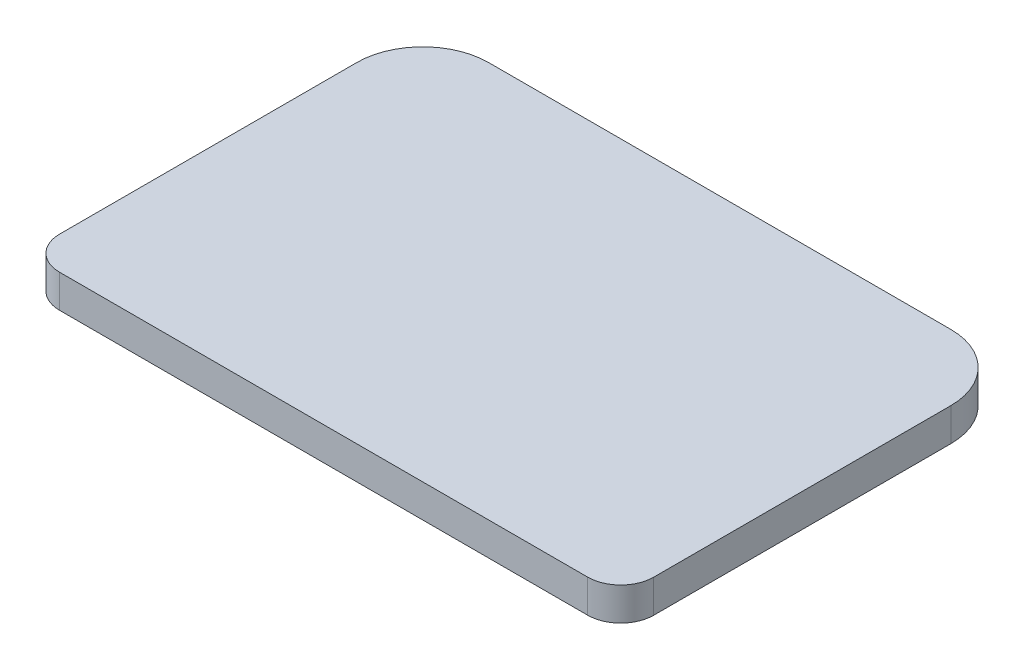
ISO-10303-21;
HEADER;
FILE_DESCRIPTION(('STEP AP214'),'2;1');
FILE_NAME('part.step','',(''),(''),'','','');
FILE_SCHEMA(('AUTOMOTIVE_DESIGN { 1 0 10303 214 1 1 1 1 }'));
ENDSEC;
DATA;
#1=APPLICATION_CONTEXT('core data for automotive mechanical design processes');
#2=APPLICATION_PROTOCOL_DEFINITION('international standard','automotive_design',2000,#1);
#3=PRODUCT_CONTEXT('',#1,'mechanical');
#4=PRODUCT('Part','Part','',(#3));
#5=PRODUCT_RELATED_PRODUCT_CATEGORY('part','',(#4));
#6=PRODUCT_DEFINITION_FORMATION('','',#4);
#7=PRODUCT_DEFINITION_CONTEXT('part definition',#1,'design');
#8=PRODUCT_DEFINITION('design','',#6,#7);
#9=PRODUCT_DEFINITION_SHAPE('','',#8);
#10=(LENGTH_UNIT() NAMED_UNIT(*) SI_UNIT(.MILLI.,.METRE.));
#11=(NAMED_UNIT(*) PLANE_ANGLE_UNIT() SI_UNIT($,.RADIAN.));
#12=(NAMED_UNIT(*) SI_UNIT($,.STERADIAN.) SOLID_ANGLE_UNIT());
#13=UNCERTAINTY_MEASURE_WITH_UNIT(LENGTH_MEASURE(1.E-05),#10,'distance_accuracy_value','');
#14=(GEOMETRIC_REPRESENTATION_CONTEXT(3) GLOBAL_UNCERTAINTY_ASSIGNED_CONTEXT((#13)) GLOBAL_UNIT_ASSIGNED_CONTEXT((#10,
#11,#12)) REPRESENTATION_CONTEXT('',''));
#15=CARTESIAN_POINT('',(0.,0.,0.));
#16=DIRECTION('',(0.,0.,1.));
#17=DIRECTION('',(1.,0.,0.));
#18=AXIS2_PLACEMENT_3D('',#15,#16,#17);
#19=CARTESIAN_POINT('',(28.575,3.175,19.05));
#20=DIRECTION('',(-1.,0.,0.));
#21=DIRECTION('',(0.,0.,-1.));
#22=AXIS2_PLACEMENT_3D('',#19,#20,#21);
#23=PLANE('',#22);
#24=DIRECTION('',(0.,0.,1.));
#25=VECTOR('',#24,1.);
#26=CARTESIAN_POINT('',(28.575,0.,19.05));
#27=LINE('',#26,#25);
#28=CARTESIAN_POINT('',(28.575,0.,-12.7));
#29=VERTEX_POINT('',#28);
#30=CARTESIAN_POINT('',(28.575,0.,15.875));
#31=VERTEX_POINT('',#30);
#32=EDGE_CURVE('E111',#29,#31,#27,.T.);
#33=ORIENTED_EDGE('',*,*,#32,.F.);
#34=DIRECTION('',(0.,-1.,0.));
#35=VECTOR('',#34,1.);
#36=CARTESIAN_POINT('',(28.575,3.175,-12.7));
#37=LINE('',#36,#35);
#38=CARTESIAN_POINT('',(28.575,3.175,-12.7));
#39=VERTEX_POINT('',#38);
#40=EDGE_CURVE('E121',#39,#29,#37,.T.);
#41=ORIENTED_EDGE('',*,*,#40,.F.);
#42=DIRECTION('',(0.,0.,1.));
#43=VECTOR('',#42,1.);
#44=CARTESIAN_POINT('',(28.575,3.175,19.05));
#45=LINE('',#44,#43);
#46=CARTESIAN_POINT('',(28.575,3.175,15.875));
#47=VERTEX_POINT('',#46);
#48=EDGE_CURVE('E139',#39,#47,#45,.T.);
#49=ORIENTED_EDGE('',*,*,#48,.T.);
#50=DIRECTION('',(0.,-1.,0.));
#51=VECTOR('',#50,1.);
#52=CARTESIAN_POINT('',(28.575,3.175,15.875));
#53=LINE('',#52,#51);
#54=EDGE_CURVE('E129',#31,#47,#53,.F.);
#55=ORIENTED_EDGE('',*,*,#54,.F.);
#56=EDGE_LOOP('',(#33,#41,#49,#55));
#57=FACE_BOUND('',#56,.T.);
#58=ADVANCED_FACE('F41',(#57),#23,.F.);
#59=CARTESIAN_POINT('',(-28.575,3.175,19.05));
#60=DIRECTION('',(0.,0.,-1.));
#61=DIRECTION('',(1.,0.,0.));
#62=AXIS2_PLACEMENT_3D('',#59,#60,#61);
#63=PLANE('',#62);
#64=DIRECTION('',(-1.,0.,0.));
#65=VECTOR('',#64,1.);
#66=CARTESIAN_POINT('',(-28.575,3.175,19.05));
#67=LINE('',#66,#65);
#68=CARTESIAN_POINT('',(25.4,3.175,19.05));
#69=VERTEX_POINT('',#68);
#70=CARTESIAN_POINT('',(-25.4,3.175,19.05));
#71=VERTEX_POINT('',#70);
#72=EDGE_CURVE('E170',#69,#71,#67,.T.);
#73=ORIENTED_EDGE('',*,*,#72,.T.);
#74=DIRECTION('',(0.,-1.,0.));
#75=VECTOR('',#74,1.);
#76=CARTESIAN_POINT('',(-25.4,3.175,19.05));
#77=LINE('',#76,#75);
#78=CARTESIAN_POINT('',(-25.4,0.,19.05));
#79=VERTEX_POINT('',#78);
#80=EDGE_CURVE('E152',#79,#71,#77,.F.);
#81=ORIENTED_EDGE('',*,*,#80,.F.);
#82=DIRECTION('',(-1.,0.,0.));
#83=VECTOR('',#82,1.);
#84=CARTESIAN_POINT('',(-28.575,0.,19.05));
#85=LINE('',#84,#83);
#86=CARTESIAN_POINT('',(25.4,0.,19.05));
#87=VERTEX_POINT('',#86);
#88=EDGE_CURVE('E130',#87,#79,#85,.T.);
#89=ORIENTED_EDGE('',*,*,#88,.F.);
#90=DIRECTION('',(0.,-1.,0.));
#91=VECTOR('',#90,1.);
#92=CARTESIAN_POINT('',(25.4,3.175,19.05));
#93=LINE('',#92,#91);
#94=EDGE_CURVE('E154',#69,#87,#93,.T.);
#95=ORIENTED_EDGE('',*,*,#94,.F.);
#96=EDGE_LOOP('',(#73,#81,#89,#95));
#97=FACE_BOUND('',#96,.T.);
#98=ADVANCED_FACE('F168',(#97),#63,.F.);
#99=CARTESIAN_POINT('',(-28.575,3.175,19.05));
#100=DIRECTION('',(1.,0.,0.));
#101=DIRECTION('',(0.,0.,1.));
#102=AXIS2_PLACEMENT_3D('',#99,#100,#101);
#103=PLANE('',#102);
#104=DIRECTION('',(0.,0.,-1.));
#105=VECTOR('',#104,1.);
#106=CARTESIAN_POINT('',(-28.575,3.175,19.05));
#107=LINE('',#106,#105);
#108=CARTESIAN_POINT('',(-28.575,3.175,15.875));
#109=VERTEX_POINT('',#108);
#110=CARTESIAN_POINT('',(-28.575,3.175,-12.7));
#111=VERTEX_POINT('',#110);
#112=EDGE_CURVE('E173',#109,#111,#107,.T.);
#113=ORIENTED_EDGE('',*,*,#112,.T.);
#114=DIRECTION('',(0.,-1.,0.));
#115=VECTOR('',#114,1.);
#116=CARTESIAN_POINT('',(-28.575,3.175,-12.7));
#117=LINE('',#116,#115);
#118=CARTESIAN_POINT('',(-28.575,0.,-12.7));
#119=VERTEX_POINT('',#118);
#120=EDGE_CURVE('E149',#119,#111,#117,.F.);
#121=ORIENTED_EDGE('',*,*,#120,.F.);
#122=DIRECTION('',(0.,0.,-1.));
#123=VECTOR('',#122,1.);
#124=CARTESIAN_POINT('',(-28.575,0.,19.05));
#125=LINE('',#124,#123);
#126=CARTESIAN_POINT('',(-28.575,0.,15.875));
#127=VERTEX_POINT('',#126);
#128=EDGE_CURVE('E132',#127,#119,#125,.T.);
#129=ORIENTED_EDGE('',*,*,#128,.F.);
#130=DIRECTION('',(0.,-1.,0.));
#131=VECTOR('',#130,1.);
#132=CARTESIAN_POINT('',(-28.575,3.175,15.875));
#133=LINE('',#132,#131);
#134=EDGE_CURVE('E11',#109,#127,#133,.T.);
#135=ORIENTED_EDGE('',*,*,#134,.F.);
#136=EDGE_LOOP('',(#113,#121,#129,#135));
#137=FACE_BOUND('',#136,.T.);
#138=ADVANCED_FACE('F186',(#137),#103,.F.);
#139=CARTESIAN_POINT('',(-28.575,3.175,-19.05));
#140=DIRECTION('',(0.,0.,1.));
#141=DIRECTION('',(-1.,0.,0.));
#142=AXIS2_PLACEMENT_3D('',#139,#140,#141);
#143=PLANE('',#142);
#144=DIRECTION('',(1.,0.,0.));
#145=VECTOR('',#144,1.);
#146=CARTESIAN_POINT('',(-28.575,0.,-19.05));
#147=LINE('',#146,#145);
#148=CARTESIAN_POINT('',(-22.225,0.,-19.05));
#149=VERTEX_POINT('',#148);
#150=CARTESIAN_POINT('',(22.225,0.,-19.05));
#151=VERTEX_POINT('',#150);
#152=EDGE_CURVE('E113',#149,#151,#147,.T.);
#153=ORIENTED_EDGE('',*,*,#152,.F.);
#154=DIRECTION('',(0.,-1.,0.));
#155=VECTOR('',#154,1.);
#156=CARTESIAN_POINT('',(-22.225,3.175,-19.05));
#157=LINE('',#156,#155);
#158=CARTESIAN_POINT('',(-22.225,3.175,-19.05));
#159=VERTEX_POINT('',#158);
#160=EDGE_CURVE('E117',#159,#149,#157,.T.);
#161=ORIENTED_EDGE('',*,*,#160,.F.);
#162=DIRECTION('',(1.,0.,0.));
#163=VECTOR('',#162,1.);
#164=CARTESIAN_POINT('',(-28.575,3.175,-19.05));
#165=LINE('',#164,#163);
#166=CARTESIAN_POINT('',(22.225,3.175,-19.05));
#167=VERTEX_POINT('',#166);
#168=EDGE_CURVE('E126',#159,#167,#165,.T.);
#169=ORIENTED_EDGE('',*,*,#168,.T.);
#170=DIRECTION('',(0.,-1.,0.));
#171=VECTOR('',#170,1.);
#172=CARTESIAN_POINT('',(22.225,3.175,-19.05));
#173=LINE('',#172,#171);
#174=EDGE_CURVE('E144',#151,#167,#173,.F.);
#175=ORIENTED_EDGE('',*,*,#174,.F.);
#176=EDGE_LOOP('',(#153,#161,#169,#175));
#177=FACE_BOUND('',#176,.T.);
#178=ADVANCED_FACE('F181',(#177),#143,.F.);
#179=CARTESIAN_POINT('',(0.,3.175,0.));
#180=DIRECTION('',(0.,1.,0.));
#181=DIRECTION('',(0.,0.,-1.));
#182=AXIS2_PLACEMENT_3D('',#179,#180,#181);
#183=PLANE('',#182);
#184=ORIENTED_EDGE('',*,*,#48,.F.);
#185=CARTESIAN_POINT('',(22.225,3.175,-12.7));
#186=DIRECTION('',(0.,-1.,0.));
#187=DIRECTION('',(0.,0.,-1.));
#188=AXIS2_PLACEMENT_3D('',#185,#186,#187);
#189=CIRCLE('',#188,6.35);
#190=EDGE_CURVE('E123',#167,#39,#189,.T.);
#191=ORIENTED_EDGE('',*,*,#190,.F.);
#192=ORIENTED_EDGE('',*,*,#168,.F.);
#193=CARTESIAN_POINT('',(-22.225,3.175,-12.7));
#194=DIRECTION('',(0.,-1.,0.));
#195=DIRECTION('',(0.,0.,-1.));
#196=AXIS2_PLACEMENT_3D('',#193,#194,#195);
#197=CIRCLE('',#196,6.35);
#198=EDGE_CURVE('E146',#111,#159,#197,.T.);
#199=ORIENTED_EDGE('',*,*,#198,.F.);
#200=ORIENTED_EDGE('',*,*,#112,.F.);
#201=CARTESIAN_POINT('',(-25.4,3.175,15.875));
#202=DIRECTION('',(0.,-1.,0.));
#203=DIRECTION('',(0.,0.,-1.));
#204=AXIS2_PLACEMENT_3D('',#201,#202,#203);
#205=CIRCLE('',#204,3.175);
#206=EDGE_CURVE('E55',#71,#109,#205,.T.);
#207=ORIENTED_EDGE('',*,*,#206,.F.);
#208=ORIENTED_EDGE('',*,*,#72,.F.);
#209=CARTESIAN_POINT('',(25.4,3.175,15.875));
#210=DIRECTION('',(0.,-1.,0.));
#211=DIRECTION('',(0.,0.,-1.));
#212=AXIS2_PLACEMENT_3D('',#209,#210,#211);
#213=CIRCLE('',#212,3.175);
#214=EDGE_CURVE('E49',#47,#69,#213,.T.);
#215=ORIENTED_EDGE('',*,*,#214,.F.);
#216=EDGE_LOOP('',(#184,#191,#192,#199,#200,#207,#208,#215));
#217=FACE_BOUND('',#216,.T.);
#218=ADVANCED_FACE('F171',(#217),#183,.T.);
#219=CARTESIAN_POINT('',(0.,0.,0.));
#220=DIRECTION('',(0.,1.,0.));
#221=DIRECTION('',(0.,0.,-1.));
#222=AXIS2_PLACEMENT_3D('',#219,#220,#221);
#223=PLANE('',#222);
#224=ORIENTED_EDGE('',*,*,#88,.T.);
#225=CARTESIAN_POINT('',(-25.4,0.,15.875));
#226=DIRECTION('',(0.,-1.,0.));
#227=DIRECTION('',(0.,0.,-1.));
#228=AXIS2_PLACEMENT_3D('',#225,#226,#227);
#229=CIRCLE('',#228,3.175);
#230=EDGE_CURVE('E157',#127,#79,#229,.F.);
#231=ORIENTED_EDGE('',*,*,#230,.F.);
#232=ORIENTED_EDGE('',*,*,#128,.T.);
#233=CARTESIAN_POINT('',(-22.225,0.,-12.7));
#234=DIRECTION('',(0.,-1.,0.));
#235=DIRECTION('',(0.,0.,-1.));
#236=AXIS2_PLACEMENT_3D('',#233,#234,#235);
#237=CIRCLE('',#236,6.35);
#238=EDGE_CURVE('E118',#149,#119,#237,.F.);
#239=ORIENTED_EDGE('',*,*,#238,.F.);
#240=ORIENTED_EDGE('',*,*,#152,.T.);
#241=CARTESIAN_POINT('',(22.225,0.,-12.7));
#242=DIRECTION('',(0.,-1.,0.));
#243=DIRECTION('',(0.,0.,-1.));
#244=AXIS2_PLACEMENT_3D('',#241,#242,#243);
#245=CIRCLE('',#244,6.35);
#246=EDGE_CURVE('E106',#29,#151,#245,.F.);
#247=ORIENTED_EDGE('',*,*,#246,.F.);
#248=ORIENTED_EDGE('',*,*,#32,.T.);
#249=CARTESIAN_POINT('',(25.4,0.,15.875));
#250=DIRECTION('',(0.,-1.,0.));
#251=DIRECTION('',(0.,0.,-1.));
#252=AXIS2_PLACEMENT_3D('',#249,#250,#251);
#253=CIRCLE('',#252,3.175);
#254=EDGE_CURVE('E159',#87,#31,#253,.F.);
#255=ORIENTED_EDGE('',*,*,#254,.F.);
#256=EDGE_LOOP('',(#224,#231,#232,#239,#240,#247,#248,#255));
#257=FACE_BOUND('',#256,.T.);
#258=ADVANCED_FACE('F109',(#257),#223,.F.);
#259=CARTESIAN_POINT('',(22.225,3.175,-12.7));
#260=DIRECTION('',(0.,-1.,0.));
#261=DIRECTION('',(0.,0.,1.));
#262=AXIS2_PLACEMENT_3D('',#259,#260,#261);
#263=CYLINDRICAL_SURFACE('',#262,6.35);
#264=ORIENTED_EDGE('',*,*,#190,.T.);
#265=ORIENTED_EDGE('',*,*,#40,.T.);
#266=ORIENTED_EDGE('',*,*,#246,.T.);
#267=ORIENTED_EDGE('',*,*,#174,.T.);
#268=EDGE_LOOP('',(#264,#265,#266,#267));
#269=FACE_BOUND('',#268,.T.);
#270=ADVANCED_FACE('F122',(#269),#263,.T.);
#271=CARTESIAN_POINT('',(-22.225,3.175,-12.7));
#272=DIRECTION('',(0.,-1.,0.));
#273=DIRECTION('',(0.,0.,1.));
#274=AXIS2_PLACEMENT_3D('',#271,#272,#273);
#275=CYLINDRICAL_SURFACE('',#274,6.35);
#276=ORIENTED_EDGE('',*,*,#198,.T.);
#277=ORIENTED_EDGE('',*,*,#160,.T.);
#278=ORIENTED_EDGE('',*,*,#238,.T.);
#279=ORIENTED_EDGE('',*,*,#120,.T.);
#280=EDGE_LOOP('',(#276,#277,#278,#279));
#281=FACE_BOUND('',#280,.T.);
#282=ADVANCED_FACE('F183',(#281),#275,.T.);
#283=CARTESIAN_POINT('',(25.4,3.175,15.875));
#284=DIRECTION('',(0.,-1.,0.));
#285=DIRECTION('',(0.,0.,1.));
#286=AXIS2_PLACEMENT_3D('',#283,#284,#285);
#287=CYLINDRICAL_SURFACE('',#286,3.175);
#288=ORIENTED_EDGE('',*,*,#214,.T.);
#289=ORIENTED_EDGE('',*,*,#94,.T.);
#290=ORIENTED_EDGE('',*,*,#254,.T.);
#291=ORIENTED_EDGE('',*,*,#54,.T.);
#292=EDGE_LOOP('',(#288,#289,#290,#291));
#293=FACE_BOUND('',#292,.T.);
#294=ADVANCED_FACE('F164',(#293),#287,.T.);
#295=CARTESIAN_POINT('',(-25.4,3.175,15.875));
#296=DIRECTION('',(0.,-1.,0.));
#297=DIRECTION('',(0.,0.,1.));
#298=AXIS2_PLACEMENT_3D('',#295,#296,#297);
#299=CYLINDRICAL_SURFACE('',#298,3.175);
#300=ORIENTED_EDGE('',*,*,#206,.T.);
#301=ORIENTED_EDGE('',*,*,#134,.T.);
#302=ORIENTED_EDGE('',*,*,#230,.T.);
#303=ORIENTED_EDGE('',*,*,#80,.T.);
#304=EDGE_LOOP('',(#300,#301,#302,#303));
#305=FACE_BOUND('',#304,.T.);
#306=ADVANCED_FACE('F43',(#305),#299,.T.);
#307=CLOSED_SHELL('',(#58,#98,#138,#178,#218,#258,#270,#282,#294,#306));
#308=MANIFOLD_SOLID_BREP('B2',#307);
#309=ADVANCED_BREP_SHAPE_REPRESENTATION('',(#18,#308),#14);
#310=SHAPE_DEFINITION_REPRESENTATION(#9,#309);
ENDSEC;
END-ISO-10303-21;
